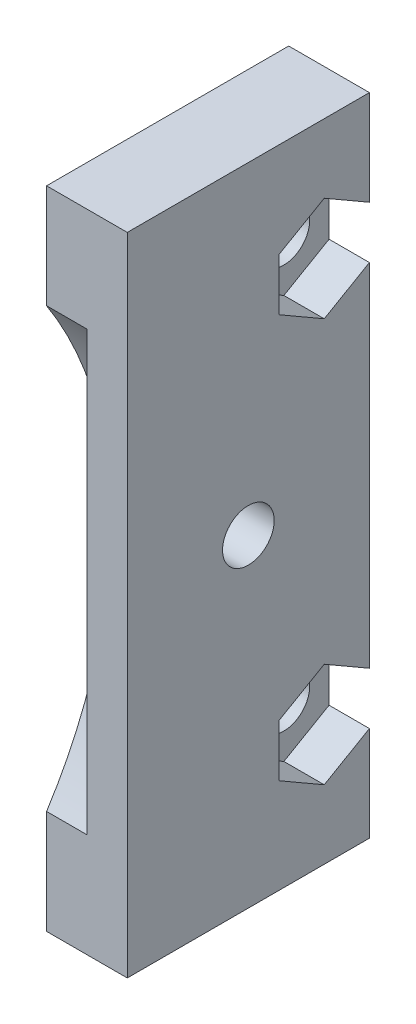
ISO-10303-21;
HEADER;
FILE_DESCRIPTION(('STEP AP214'),'2;1');
FILE_NAME('part.step','',(''),(''),'','','');
FILE_SCHEMA(('AUTOMOTIVE_DESIGN { 1 0 10303 214 1 1 1 1 }'));
ENDSEC;
DATA;
#1=APPLICATION_CONTEXT('core data for automotive mechanical design processes');
#2=APPLICATION_PROTOCOL_DEFINITION('international standard','automotive_design',2000,#1);
#3=PRODUCT_CONTEXT('',#1,'mechanical');
#4=PRODUCT('Part','Part','',(#3));
#5=PRODUCT_RELATED_PRODUCT_CATEGORY('part','',(#4));
#6=PRODUCT_DEFINITION_FORMATION('','',#4);
#7=PRODUCT_DEFINITION_CONTEXT('part definition',#1,'design');
#8=PRODUCT_DEFINITION('design','',#6,#7);
#9=PRODUCT_DEFINITION_SHAPE('','',#8);
#10=(LENGTH_UNIT() NAMED_UNIT(*) SI_UNIT(.MILLI.,.METRE.));
#11=(NAMED_UNIT(*) PLANE_ANGLE_UNIT() SI_UNIT($,.RADIAN.));
#12=(NAMED_UNIT(*) SI_UNIT($,.STERADIAN.) SOLID_ANGLE_UNIT());
#13=UNCERTAINTY_MEASURE_WITH_UNIT(LENGTH_MEASURE(1.E-05),#10,'distance_accuracy_value','');
#14=(GEOMETRIC_REPRESENTATION_CONTEXT(3) GLOBAL_UNCERTAINTY_ASSIGNED_CONTEXT((#13)) GLOBAL_UNIT_ASSIGNED_CONTEXT((#10,
#11,#12)) REPRESENTATION_CONTEXT('',''));
#15=CARTESIAN_POINT('',(0.,0.,0.));
#16=DIRECTION('',(0.,0.,1.));
#17=DIRECTION('',(1.,0.,0.));
#18=AXIS2_PLACEMENT_3D('',#15,#16,#17);
#19=CARTESIAN_POINT('',(-2.5,0.,0.));
#20=DIRECTION('',(1.,0.,0.));
#21=DIRECTION('',(0.,0.,-1.));
#22=AXIS2_PLACEMENT_3D('',#19,#20,#21);
#23=PLANE('',#22);
#24=CARTESIAN_POINT('',(-2.5,7.5,-12.2));
#25=DIRECTION('',(1.,0.,0.));
#26=DIRECTION('',(0.,0.,-1.));
#27=AXIS2_PLACEMENT_3D('',#24,#25,#26);
#28=CIRCLE('',#27,2.6);
#29=CARTESIAN_POINT('',(-2.5,7.5,-14.8));
#30=VERTEX_POINT('',#29);
#31=EDGE_CURVE('E72',#30,#30,#28,.F.);
#32=ORIENTED_EDGE('',*,*,#31,.F.);
#33=EDGE_LOOP('',(#32));
#34=FACE_BOUND('',#33,.T.);
#35=DIRECTION('',(0.,1.,0.));
#36=VECTOR('',#35,1.);
#37=CARTESIAN_POINT('',(-2.5,0.,0.));
#38=LINE('',#37,#36);
#39=CARTESIAN_POINT('',(-2.5,0.,0.));
#40=VERTEX_POINT('',#39);
#41=CARTESIAN_POINT('',(-2.5,6.43534003374946,0.));
#42=VERTEX_POINT('',#41);
#43=EDGE_CURVE('E284',#40,#42,#38,.T.);
#44=ORIENTED_EDGE('',*,*,#43,.T.);
#45=CARTESIAN_POINT('',(-2.5,20.,21.));
#46=DIRECTION('',(-1.,0.,0.));
#47=DIRECTION('',(0.,0.,1.));
#48=AXIS2_PLACEMENT_3D('',#45,#46,#47);
#49=CIRCLE('',#48,25.);
#50=CARTESIAN_POINT('',(-2.5,33.5646599662505,0.));
#51=VERTEX_POINT('',#50);
#52=EDGE_CURVE('E472',#51,#42,#49,.T.);
#53=ORIENTED_EDGE('',*,*,#52,.F.);
#54=CARTESIAN_POINT('',(-2.5,40.,0.));
#55=VERTEX_POINT('',#54);
#56=EDGE_CURVE('E393',#51,#55,#38,.T.);
#57=ORIENTED_EDGE('',*,*,#56,.T.);
#58=DIRECTION('',(0.,0.,-1.));
#59=VECTOR('',#58,1.);
#60=CARTESIAN_POINT('',(-2.5,40.,0.));
#61=LINE('',#60,#59);
#62=CARTESIAN_POINT('',(-2.5,40.,-15.));
#63=VERTEX_POINT('',#62);
#64=EDGE_CURVE('E396',#55,#63,#61,.T.);
#65=ORIENTED_EDGE('',*,*,#64,.T.);
#66=DIRECTION('',(0.,1.,0.));
#67=VECTOR('',#66,1.);
#68=CARTESIAN_POINT('',(-2.5,0.,-15.));
#69=LINE('',#68,#67);
#70=CARTESIAN_POINT('',(-2.5,0.,-15.));
#71=VERTEX_POINT('',#70);
#72=EDGE_CURVE('E197',#71,#63,#69,.T.);
#73=ORIENTED_EDGE('',*,*,#72,.F.);
#74=DIRECTION('',(0.,0.,-1.));
#75=VECTOR('',#74,1.);
#76=CARTESIAN_POINT('',(-2.5,0.,0.));
#77=LINE('',#76,#75);
#78=EDGE_CURVE('E385',#40,#71,#77,.T.);
#79=ORIENTED_EDGE('',*,*,#78,.F.);
#80=EDGE_LOOP('',(#44,#53,#57,#65,#73,#79));
#81=FACE_BOUND('',#80,.T.);
#82=CARTESIAN_POINT('',(-2.5,20.,-7.5));
#83=DIRECTION('',(1.,0.,0.));
#84=DIRECTION('',(0.,0.,-1.));
#85=AXIS2_PLACEMENT_3D('',#82,#83,#84);
#86=CIRCLE('',#85,1.6);
#87=CARTESIAN_POINT('',(-2.5,20.,-9.1));
#88=VERTEX_POINT('',#87);
#89=EDGE_CURVE('E215',#88,#88,#86,.T.);
#90=ORIENTED_EDGE('',*,*,#89,.T.);
#91=EDGE_LOOP('',(#90));
#92=FACE_BOUND('',#91,.T.);
#93=CARTESIAN_POINT('',(-2.5,32.5,-12.2));
#94=DIRECTION('',(1.,0.,0.));
#95=DIRECTION('',(0.,0.,-1.));
#96=AXIS2_PLACEMENT_3D('',#93,#94,#95);
#97=CIRCLE('',#96,2.6);
#98=CARTESIAN_POINT('',(-2.5,32.5,-14.8));
#99=VERTEX_POINT('',#98);
#100=EDGE_CURVE('E12',#99,#99,#97,.F.);
#101=ORIENTED_EDGE('',*,*,#100,.F.);
#102=EDGE_LOOP('',(#101));
#103=FACE_BOUND('',#102,.T.);
#104=ADVANCED_FACE('F64',(#34,#81,#92,#103),#23,.F.);
#105=CARTESIAN_POINT('',(2.5,0.,0.));
#106=DIRECTION('',(0.,1.,0.));
#107=DIRECTION('',(0.,0.,1.));
#108=AXIS2_PLACEMENT_3D('',#105,#106,#107);
#109=PLANE('',#108);
#110=DIRECTION('',(-1.,0.,0.));
#111=VECTOR('',#110,1.);
#112=CARTESIAN_POINT('',(2.5,0.,0.));
#113=LINE('',#112,#111);
#114=CARTESIAN_POINT('',(2.5,0.,0.));
#115=VERTEX_POINT('',#114);
#116=EDGE_CURVE('E87',#115,#40,#113,.T.);
#117=ORIENTED_EDGE('',*,*,#116,.T.);
#118=ORIENTED_EDGE('',*,*,#78,.T.);
#119=DIRECTION('',(-1.,0.,0.));
#120=VECTOR('',#119,1.);
#121=CARTESIAN_POINT('',(2.5,0.,-15.));
#122=LINE('',#121,#120);
#123=CARTESIAN_POINT('',(2.5,0.,-15.));
#124=VERTEX_POINT('',#123);
#125=EDGE_CURVE('E269',#124,#71,#122,.T.);
#126=ORIENTED_EDGE('',*,*,#125,.F.);
#127=DIRECTION('',(0.,0.,-1.));
#128=VECTOR('',#127,1.);
#129=CARTESIAN_POINT('',(2.5,0.,0.));
#130=LINE('',#129,#128);
#131=EDGE_CURVE('E386',#115,#124,#130,.T.);
#132=ORIENTED_EDGE('',*,*,#131,.F.);
#133=EDGE_LOOP('',(#117,#118,#126,#132));
#134=FACE_BOUND('',#133,.T.);
#135=ADVANCED_FACE('F277',(#134),#109,.F.);
#136=CARTESIAN_POINT('',(2.5,-2.08262609368152,-1.20240473580836));
#137=DIRECTION('',(0.,0.866025403784439,0.5));
#138=DIRECTION('',(0.,-0.5,0.866025403784439));
#139=AXIS2_PLACEMENT_3D('',#136,#137,#138);
#140=PLANE('',#139);
#141=DIRECTION('',(0.,0.5,-0.866025403784439));
#142=VECTOR('',#141,1.);
#143=CARTESIAN_POINT('',(0.,-2.08262609368152,-1.20240473580836));
#144=LINE('',#143,#142);
#145=CARTESIAN_POINT('',(0.,4.26683849253807,-12.2));
#146=VERTEX_POINT('',#145);
#147=CARTESIAN_POINT('',(0.,5.88341924626902,-15.));
#148=VERTEX_POINT('',#147);
#149=EDGE_CURVE('E211',#146,#148,#144,.T.);
#150=ORIENTED_EDGE('',*,*,#149,.F.);
#151=DIRECTION('',(-1.,0.,0.));
#152=VECTOR('',#151,1.);
#153=CARTESIAN_POINT('',(2.5,4.26683849253807,-12.2));
#154=LINE('',#153,#152);
#155=CARTESIAN_POINT('',(2.5,4.26683849253807,-12.2));
#156=VERTEX_POINT('',#155);
#157=EDGE_CURVE('E264',#156,#146,#154,.T.);
#158=ORIENTED_EDGE('',*,*,#157,.F.);
#159=DIRECTION('',(0.,0.5,-0.866025403784439));
#160=VECTOR('',#159,1.);
#161=CARTESIAN_POINT('',(2.5,-2.08262609368152,-1.20240473580836));
#162=LINE('',#161,#160);
#163=CARTESIAN_POINT('',(2.5,5.88341924626902,-15.));
#164=VERTEX_POINT('',#163);
#165=EDGE_CURVE('E416',#156,#164,#162,.T.);
#166=ORIENTED_EDGE('',*,*,#165,.T.);
#167=DIRECTION('',(-1.,0.,0.));
#168=VECTOR('',#167,1.);
#169=CARTESIAN_POINT('',(2.5,5.88341924626902,-15.));
#170=LINE('',#169,#168);
#171=EDGE_CURVE('E266',#164,#148,#170,.T.);
#172=ORIENTED_EDGE('',*,*,#171,.T.);
#173=EDGE_LOOP('',(#150,#158,#166,#172));
#174=FACE_BOUND('',#173,.T.);
#175=ADVANCED_FACE('F372',(#174),#140,.T.);
#176=CARTESIAN_POINT('',(2.5,8.48288383248863,-4.89759526419164));
#177=DIRECTION('',(0.,0.866025403784438,-0.5));
#178=DIRECTION('',(0.,0.5,0.866025403784438));
#179=AXIS2_PLACEMENT_3D('',#176,#177,#178);
#180=PLANE('',#179);
#181=DIRECTION('',(0.,-0.5,-0.866025403784438));
#182=VECTOR('',#181,1.);
#183=CARTESIAN_POINT('',(0.,8.48288383248863,-4.89759526419164));
#184=LINE('',#183,#182);
#185=CARTESIAN_POINT('',(0.,5.88341924626904,-9.39999999999997));
#186=VERTEX_POINT('',#185);
#187=EDGE_CURVE('E214',#186,#146,#184,.T.);
#188=ORIENTED_EDGE('',*,*,#187,.F.);
#189=DIRECTION('',(-1.,0.,0.));
#190=VECTOR('',#189,1.);
#191=CARTESIAN_POINT('',(2.5,5.88341924626904,-9.39999999999997));
#192=LINE('',#191,#190);
#193=CARTESIAN_POINT('',(2.5,5.88341924626904,-9.39999999999997));
#194=VERTEX_POINT('',#193);
#195=EDGE_CURVE('E262',#194,#186,#192,.T.);
#196=ORIENTED_EDGE('',*,*,#195,.F.);
#197=DIRECTION('',(0.,-0.5,-0.866025403784438));
#198=VECTOR('',#197,1.);
#199=CARTESIAN_POINT('',(2.5,8.48288383248863,-4.89759526419164));
#200=LINE('',#199,#198);
#201=EDGE_CURVE('E419',#194,#156,#200,.T.);
#202=ORIENTED_EDGE('',*,*,#201,.T.);
#203=ORIENTED_EDGE('',*,*,#157,.T.);
#204=EDGE_LOOP('',(#188,#196,#202,#203));
#205=FACE_BOUND('',#204,.T.);
#206=ADVANCED_FACE('F368',(#205),#180,.T.);
#207=CARTESIAN_POINT('',(2.5,0.,-9.39999999999997));
#208=DIRECTION('',(0.,0.,-1.));
#209=DIRECTION('',(-1.,0.,0.));
#210=AXIS2_PLACEMENT_3D('',#207,#208,#209);
#211=PLANE('',#210);
#212=DIRECTION('',(0.,-1.,0.));
#213=VECTOR('',#212,1.);
#214=CARTESIAN_POINT('',(0.,0.,-9.39999999999997));
#215=LINE('',#214,#213);
#216=CARTESIAN_POINT('',(0.,9.11658075373097,-9.39999999999998));
#217=VERTEX_POINT('',#216);
#218=EDGE_CURVE('E218',#217,#186,#215,.T.);
#219=ORIENTED_EDGE('',*,*,#218,.F.);
#220=DIRECTION('',(-1.,0.,0.));
#221=VECTOR('',#220,1.);
#222=CARTESIAN_POINT('',(2.5,9.11658075373097,-9.39999999999998));
#223=LINE('',#222,#221);
#224=CARTESIAN_POINT('',(2.5,9.11658075373097,-9.39999999999998));
#225=VERTEX_POINT('',#224);
#226=EDGE_CURVE('E260',#225,#217,#223,.T.);
#227=ORIENTED_EDGE('',*,*,#226,.F.);
#228=DIRECTION('',(0.,-1.,0.));
#229=VECTOR('',#228,1.);
#230=CARTESIAN_POINT('',(2.5,0.,-9.39999999999997));
#231=LINE('',#230,#229);
#232=EDGE_CURVE('E422',#225,#194,#231,.T.);
#233=ORIENTED_EDGE('',*,*,#232,.T.);
#234=ORIENTED_EDGE('',*,*,#195,.T.);
#235=EDGE_LOOP('',(#219,#227,#233,#234));
#236=FACE_BOUND('',#235,.T.);
#237=ADVANCED_FACE('F364',(#236),#211,.T.);
#238=CARTESIAN_POINT('',(2.5,2.76711616751138,1.59759526419166));
#239=DIRECTION('',(0.,-0.866025403784439,-0.5));
#240=DIRECTION('',(0.,0.5,-0.866025403784439));
#241=AXIS2_PLACEMENT_3D('',#238,#239,#240);
#242=PLANE('',#241);
#243=DIRECTION('',(0.,-0.5,0.866025403784439));
#244=VECTOR('',#243,1.);
#245=CARTESIAN_POINT('',(0.,2.76711616751138,1.59759526419166));
#246=LINE('',#245,#244);
#247=CARTESIAN_POINT('',(0.,10.7331615074619,-12.2));
#248=VERTEX_POINT('',#247);
#249=EDGE_CURVE('E221',#248,#217,#246,.T.);
#250=ORIENTED_EDGE('',*,*,#249,.F.);
#251=DIRECTION('',(-1.,0.,0.));
#252=VECTOR('',#251,1.);
#253=CARTESIAN_POINT('',(2.5,10.7331615074619,-12.2));
#254=LINE('',#253,#252);
#255=CARTESIAN_POINT('',(2.5,10.7331615074619,-12.2));
#256=VERTEX_POINT('',#255);
#257=EDGE_CURVE('E258',#256,#248,#254,.T.);
#258=ORIENTED_EDGE('',*,*,#257,.F.);
#259=DIRECTION('',(0.,-0.5,0.866025403784439));
#260=VECTOR('',#259,1.);
#261=CARTESIAN_POINT('',(2.5,2.76711616751138,1.59759526419166));
#262=LINE('',#261,#260);
#263=EDGE_CURVE('E425',#256,#225,#262,.T.);
#264=ORIENTED_EDGE('',*,*,#263,.T.);
#265=ORIENTED_EDGE('',*,*,#226,.T.);
#266=EDGE_LOOP('',(#250,#258,#264,#265));
#267=FACE_BOUND('',#266,.T.);
#268=ADVANCED_FACE('F360',(#267),#242,.T.);
#269=CARTESIAN_POINT('',(2.5,13.3326260936815,-7.69759526419166));
#270=DIRECTION('',(0.,-0.866025403784439,0.5));
#271=DIRECTION('',(0.,-0.5,-0.866025403784439));
#272=AXIS2_PLACEMENT_3D('',#269,#270,#271);
#273=PLANE('',#272);
#274=DIRECTION('',(0.,0.5,0.866025403784439));
#275=VECTOR('',#274,1.);
#276=CARTESIAN_POINT('',(0.,13.3326260936815,-7.69759526419166));
#277=LINE('',#276,#275);
#278=CARTESIAN_POINT('',(0.,9.11658075373096,-15.));
#279=VERTEX_POINT('',#278);
#280=EDGE_CURVE('E224',#279,#248,#277,.T.);
#281=ORIENTED_EDGE('',*,*,#280,.F.);
#282=DIRECTION('',(-1.,0.,0.));
#283=VECTOR('',#282,1.);
#284=CARTESIAN_POINT('',(2.5,9.11658075373096,-15.));
#285=LINE('',#284,#283);
#286=CARTESIAN_POINT('',(2.5,9.11658075373096,-15.));
#287=VERTEX_POINT('',#286);
#288=EDGE_CURVE('E256',#287,#279,#285,.T.);
#289=ORIENTED_EDGE('',*,*,#288,.F.);
#290=DIRECTION('',(0.,0.5,0.866025403784439));
#291=VECTOR('',#290,1.);
#292=CARTESIAN_POINT('',(2.5,13.3326260936815,-7.69759526419166));
#293=LINE('',#292,#291);
#294=EDGE_CURVE('E428',#287,#256,#293,.T.);
#295=ORIENTED_EDGE('',*,*,#294,.T.);
#296=ORIENTED_EDGE('',*,*,#257,.T.);
#297=EDGE_LOOP('',(#281,#289,#295,#296));
#298=FACE_BOUND('',#297,.T.);
#299=ADVANCED_FACE('F356',(#298),#273,.T.);
#300=CARTESIAN_POINT('',(2.5,16.6673739063185,9.62291281149714));
#301=DIRECTION('',(0.,0.866025403784438,0.500000000000001));
#302=DIRECTION('',(0.,-0.500000000000001,0.866025403784438));
#303=AXIS2_PLACEMENT_3D('',#300,#301,#302);
#304=PLANE('',#303);
#305=DIRECTION('',(0.,0.500000000000001,-0.866025403784438));
#306=VECTOR('',#305,1.);
#307=CARTESIAN_POINT('',(0.,16.6673739063185,9.62291281149714));
#308=LINE('',#307,#306);
#309=CARTESIAN_POINT('',(0.,29.2668384925381,-12.2));
#310=VERTEX_POINT('',#309);
#311=CARTESIAN_POINT('',(0.,30.8834192462691,-15.));
#312=VERTEX_POINT('',#311);
#313=EDGE_CURVE('E227',#310,#312,#308,.T.);
#314=ORIENTED_EDGE('',*,*,#313,.F.);
#315=DIRECTION('',(-1.,0.,0.));
#316=VECTOR('',#315,1.);
#317=CARTESIAN_POINT('',(2.5,29.2668384925381,-12.2));
#318=LINE('',#317,#316);
#319=CARTESIAN_POINT('',(2.5,29.2668384925381,-12.2));
#320=VERTEX_POINT('',#319);
#321=EDGE_CURVE('E252',#320,#310,#318,.T.);
#322=ORIENTED_EDGE('',*,*,#321,.F.);
#323=DIRECTION('',(0.,0.500000000000001,-0.866025403784438));
#324=VECTOR('',#323,1.);
#325=CARTESIAN_POINT('',(2.5,16.6673739063185,9.62291281149714));
#326=LINE('',#325,#324);
#327=CARTESIAN_POINT('',(2.5,30.8834192462691,-15.));
#328=VERTEX_POINT('',#327);
#329=EDGE_CURVE('E431',#320,#328,#326,.T.);
#330=ORIENTED_EDGE('',*,*,#329,.T.);
#331=DIRECTION('',(-1.,0.,0.));
#332=VECTOR('',#331,1.);
#333=CARTESIAN_POINT('',(2.5,30.8834192462691,-15.));
#334=LINE('',#333,#332);
#335=EDGE_CURVE('E254',#328,#312,#334,.T.);
#336=ORIENTED_EDGE('',*,*,#335,.T.);
#337=EDGE_LOOP('',(#314,#322,#330,#336));
#338=FACE_BOUND('',#337,.T.);
#339=ADVANCED_FACE('F352',(#338),#304,.T.);
#340=CARTESIAN_POINT('',(2.5,27.2328838324886,-15.7229128114972));
#341=DIRECTION('',(0.,0.866025403784438,-0.500000000000001));
#342=DIRECTION('',(0.,0.500000000000001,0.866025403784438));
#343=AXIS2_PLACEMENT_3D('',#340,#341,#342);
#344=PLANE('',#343);
#345=DIRECTION('',(0.,-0.500000000000001,-0.866025403784438));
#346=VECTOR('',#345,1.);
#347=CARTESIAN_POINT('',(0.,27.2328838324886,-15.7229128114972));
#348=LINE('',#347,#346);
#349=CARTESIAN_POINT('',(0.,30.8834192462691,-9.40000000000002));
#350=VERTEX_POINT('',#349);
#351=EDGE_CURVE('E230',#350,#310,#348,.T.);
#352=ORIENTED_EDGE('',*,*,#351,.F.);
#353=DIRECTION('',(-1.,0.,0.));
#354=VECTOR('',#353,1.);
#355=CARTESIAN_POINT('',(2.5,30.8834192462691,-9.40000000000002));
#356=LINE('',#355,#354);
#357=CARTESIAN_POINT('',(2.5,30.8834192462691,-9.40000000000002));
#358=VERTEX_POINT('',#357);
#359=EDGE_CURVE('E250',#358,#350,#356,.T.);
#360=ORIENTED_EDGE('',*,*,#359,.F.);
#361=DIRECTION('',(0.,-0.500000000000001,-0.866025403784438));
#362=VECTOR('',#361,1.);
#363=CARTESIAN_POINT('',(2.5,27.2328838324886,-15.7229128114972));
#364=LINE('',#363,#362);
#365=EDGE_CURVE('E434',#358,#320,#364,.T.);
#366=ORIENTED_EDGE('',*,*,#365,.T.);
#367=ORIENTED_EDGE('',*,*,#321,.T.);
#368=EDGE_LOOP('',(#352,#360,#366,#367));
#369=FACE_BOUND('',#368,.T.);
#370=ADVANCED_FACE('F348',(#369),#344,.T.);
#371=CARTESIAN_POINT('',(2.5,0.,-9.40000000000002));
#372=DIRECTION('',(0.,0.,-1.));
#373=DIRECTION('',(-1.,0.,0.));
#374=AXIS2_PLACEMENT_3D('',#371,#372,#373);
#375=PLANE('',#374);
#376=DIRECTION('',(0.,-1.,0.));
#377=VECTOR('',#376,1.);
#378=CARTESIAN_POINT('',(0.,0.,-9.40000000000002));
#379=LINE('',#378,#377);
#380=CARTESIAN_POINT('',(0.,34.1165807537309,-9.40000000000002));
#381=VERTEX_POINT('',#380);
#382=EDGE_CURVE('E233',#381,#350,#379,.T.);
#383=ORIENTED_EDGE('',*,*,#382,.F.);
#384=DIRECTION('',(-1.,0.,0.));
#385=VECTOR('',#384,1.);
#386=CARTESIAN_POINT('',(2.5,34.1165807537309,-9.40000000000002));
#387=LINE('',#386,#385);
#388=CARTESIAN_POINT('',(2.5,34.1165807537309,-9.40000000000002));
#389=VERTEX_POINT('',#388);
#390=EDGE_CURVE('E248',#389,#381,#387,.T.);
#391=ORIENTED_EDGE('',*,*,#390,.F.);
#392=DIRECTION('',(0.,-1.,0.));
#393=VECTOR('',#392,1.);
#394=CARTESIAN_POINT('',(2.5,0.,-9.40000000000002));
#395=LINE('',#394,#393);
#396=EDGE_CURVE('E437',#389,#358,#395,.T.);
#397=ORIENTED_EDGE('',*,*,#396,.T.);
#398=ORIENTED_EDGE('',*,*,#359,.T.);
#399=EDGE_LOOP('',(#383,#391,#397,#398));
#400=FACE_BOUND('',#399,.T.);
#401=ADVANCED_FACE('F344',(#400),#375,.T.);
#402=CARTESIAN_POINT('',(2.5,21.5171161675113,12.4229128114971));
#403=DIRECTION('',(0.,-0.866025403784438,-0.500000000000002));
#404=DIRECTION('',(0.,0.500000000000002,-0.866025403784438));
#405=AXIS2_PLACEMENT_3D('',#402,#403,#404);
#406=PLANE('',#405);
#407=DIRECTION('',(0.,-0.500000000000002,0.866025403784438));
#408=VECTOR('',#407,1.);
#409=CARTESIAN_POINT('',(0.,21.5171161675113,12.4229128114971));
#410=LINE('',#409,#408);
#411=CARTESIAN_POINT('',(0.,35.7331615074619,-12.2));
#412=VERTEX_POINT('',#411);
#413=EDGE_CURVE('E236',#412,#381,#410,.T.);
#414=ORIENTED_EDGE('',*,*,#413,.F.);
#415=DIRECTION('',(-1.,0.,0.));
#416=VECTOR('',#415,1.);
#417=CARTESIAN_POINT('',(2.5,35.7331615074619,-12.2));
#418=LINE('',#417,#416);
#419=CARTESIAN_POINT('',(2.5,35.7331615074619,-12.2));
#420=VERTEX_POINT('',#419);
#421=EDGE_CURVE('E246',#420,#412,#418,.T.);
#422=ORIENTED_EDGE('',*,*,#421,.F.);
#423=DIRECTION('',(0.,-0.500000000000002,0.866025403784438));
#424=VECTOR('',#423,1.);
#425=CARTESIAN_POINT('',(2.5,21.5171161675113,12.4229128114971));
#426=LINE('',#425,#424);
#427=EDGE_CURVE('E439',#420,#389,#426,.T.);
#428=ORIENTED_EDGE('',*,*,#427,.T.);
#429=ORIENTED_EDGE('',*,*,#390,.T.);
#430=EDGE_LOOP('',(#414,#422,#428,#429));
#431=FACE_BOUND('',#430,.T.);
#432=ADVANCED_FACE('F340',(#431),#406,.T.);
#433=CARTESIAN_POINT('',(2.5,32.0826260936814,-18.5229128114972));
#434=DIRECTION('',(0.,-0.866025403784437,0.500000000000003));
#435=DIRECTION('',(0.,-0.500000000000003,-0.866025403784437));
#436=AXIS2_PLACEMENT_3D('',#433,#434,#435);
#437=PLANE('',#436);
#438=DIRECTION('',(0.,0.500000000000003,0.866025403784437));
#439=VECTOR('',#438,1.);
#440=CARTESIAN_POINT('',(0.,32.0826260936814,-18.5229128114972));
#441=LINE('',#440,#439);
#442=CARTESIAN_POINT('',(0.,34.116580753731,-15.));
#443=VERTEX_POINT('',#442);
#444=EDGE_CURVE('E239',#443,#412,#441,.T.);
#445=ORIENTED_EDGE('',*,*,#444,.F.);
#446=DIRECTION('',(-1.,0.,0.));
#447=VECTOR('',#446,1.);
#448=CARTESIAN_POINT('',(2.5,34.116580753731,-15.));
#449=LINE('',#448,#447);
#450=CARTESIAN_POINT('',(2.5,34.116580753731,-15.));
#451=VERTEX_POINT('',#450);
#452=EDGE_CURVE('E131',#451,#443,#449,.T.);
#453=ORIENTED_EDGE('',*,*,#452,.F.);
#454=DIRECTION('',(0.,0.500000000000003,0.866025403784437));
#455=VECTOR('',#454,1.);
#456=CARTESIAN_POINT('',(2.5,32.0826260936814,-18.5229128114972));
#457=LINE('',#456,#455);
#458=EDGE_CURVE('E188',#451,#420,#457,.T.);
#459=ORIENTED_EDGE('',*,*,#458,.T.);
#460=ORIENTED_EDGE('',*,*,#421,.T.);
#461=EDGE_LOOP('',(#445,#453,#459,#460));
#462=FACE_BOUND('',#461,.T.);
#463=ADVANCED_FACE('F337',(#462),#437,.T.);
#464=CARTESIAN_POINT('',(2.5,0.,-15.));
#465=DIRECTION('',(0.,0.,1.));
#466=DIRECTION('',(1.,0.,0.));
#467=AXIS2_PLACEMENT_3D('',#464,#465,#466);
#468=PLANE('',#467);
#469=ORIENTED_EDGE('',*,*,#452,.T.);
#470=DIRECTION('',(0.,1.,0.));
#471=VECTOR('',#470,1.);
#472=CARTESIAN_POINT('',(0.,0.,-15.));
#473=LINE('',#472,#471);
#474=EDGE_CURVE('E402',#312,#443,#473,.T.);
#475=ORIENTED_EDGE('',*,*,#474,.F.);
#476=ORIENTED_EDGE('',*,*,#335,.F.);
#477=DIRECTION('',(0.,1.,0.));
#478=VECTOR('',#477,1.);
#479=CARTESIAN_POINT('',(2.5,0.,-15.));
#480=LINE('',#479,#478);
#481=EDGE_CURVE('E190',#287,#328,#480,.T.);
#482=ORIENTED_EDGE('',*,*,#481,.F.);
#483=ORIENTED_EDGE('',*,*,#288,.T.);
#484=EDGE_CURVE('E405',#148,#279,#473,.T.);
#485=ORIENTED_EDGE('',*,*,#484,.F.);
#486=ORIENTED_EDGE('',*,*,#171,.F.);
#487=EDGE_CURVE('E139',#124,#164,#480,.T.);
#488=ORIENTED_EDGE('',*,*,#487,.F.);
#489=ORIENTED_EDGE('',*,*,#125,.T.);
#490=ORIENTED_EDGE('',*,*,#72,.T.);
#491=DIRECTION('',(-1.,0.,0.));
#492=VECTOR('',#491,1.);
#493=CARTESIAN_POINT('',(2.5,40.,-15.));
#494=LINE('',#493,#492);
#495=CARTESIAN_POINT('',(2.5,40.,-15.));
#496=VERTEX_POINT('',#495);
#497=EDGE_CURVE('E193',#496,#63,#494,.T.);
#498=ORIENTED_EDGE('',*,*,#497,.F.);
#499=EDGE_CURVE('E180',#451,#496,#480,.T.);
#500=ORIENTED_EDGE('',*,*,#499,.F.);
#501=EDGE_LOOP('',(#469,#475,#476,#482,#483,#485,#486,#488,#489,#490,#498,#500));
#502=FACE_BOUND('',#501,.T.);
#503=ADVANCED_FACE('F194',(#502),#468,.F.);
#504=CARTESIAN_POINT('',(2.5,40.,0.));
#505=DIRECTION('',(0.,1.,0.));
#506=DIRECTION('',(0.,0.,1.));
#507=AXIS2_PLACEMENT_3D('',#504,#505,#506);
#508=PLANE('',#507);
#509=ORIENTED_EDGE('',*,*,#497,.T.);
#510=ORIENTED_EDGE('',*,*,#64,.F.);
#511=DIRECTION('',(-1.,0.,0.));
#512=VECTOR('',#511,1.);
#513=CARTESIAN_POINT('',(2.5,40.,0.));
#514=LINE('',#513,#512);
#515=CARTESIAN_POINT('',(2.5,40.,0.));
#516=VERTEX_POINT('',#515);
#517=EDGE_CURVE('E201',#516,#55,#514,.T.);
#518=ORIENTED_EDGE('',*,*,#517,.F.);
#519=DIRECTION('',(0.,0.,-1.));
#520=VECTOR('',#519,1.);
#521=CARTESIAN_POINT('',(2.5,40.,0.));
#522=LINE('',#521,#520);
#523=EDGE_CURVE('E185',#516,#496,#522,.T.);
#524=ORIENTED_EDGE('',*,*,#523,.T.);
#525=EDGE_LOOP('',(#509,#510,#518,#524));
#526=FACE_BOUND('',#525,.T.);
#527=ADVANCED_FACE('F203',(#526),#508,.T.);
#528=CARTESIAN_POINT('',(2.5,20.,-7.5));
#529=DIRECTION('',(-1.,0.,0.));
#530=DIRECTION('',(0.,0.,1.));
#531=AXIS2_PLACEMENT_3D('',#528,#529,#530);
#532=CYLINDRICAL_SURFACE('',#531,1.6);
#533=CARTESIAN_POINT('',(2.5,20.,-7.5));
#534=DIRECTION('',(1.,0.,0.));
#535=DIRECTION('',(0.,0.,-1.));
#536=AXIS2_PLACEMENT_3D('',#533,#534,#535);
#537=CIRCLE('',#536,1.6);
#538=CARTESIAN_POINT('',(2.5,20.,-9.1));
#539=VERTEX_POINT('',#538);
#540=EDGE_CURVE('E242',#539,#539,#537,.T.);
#541=ORIENTED_EDGE('',*,*,#540,.T.);
#542=EDGE_LOOP('',(#541));
#543=FACE_BOUND('',#542,.T.);
#544=ORIENTED_EDGE('',*,*,#89,.F.);
#545=EDGE_LOOP('',(#544));
#546=FACE_BOUND('',#545,.T.);
#547=ADVANCED_FACE('F66',(#543,#546),#532,.F.);
#548=CARTESIAN_POINT('',(2.5,0.,0.));
#549=DIRECTION('',(0.,0.,1.));
#550=DIRECTION('',(1.,0.,0.));
#551=AXIS2_PLACEMENT_3D('',#548,#549,#550);
#552=PLANE('',#551);
#553=DIRECTION('',(-1.,0.,0.));
#554=VECTOR('',#553,1.);
#555=CARTESIAN_POINT('',(0.,33.5646599662505,0.));
#556=LINE('',#555,#554);
#557=CARTESIAN_POINT('',(0.,33.5646599662505,0.));
#558=VERTEX_POINT('',#557);
#559=EDGE_CURVE('E474',#558,#51,#556,.T.);
#560=ORIENTED_EDGE('',*,*,#559,.F.);
#561=DIRECTION('',(0.,1.,0.));
#562=VECTOR('',#561,1.);
#563=CARTESIAN_POINT('',(0.,0.,0.));
#564=LINE('',#563,#562);
#565=CARTESIAN_POINT('',(0.,6.43534003374946,0.));
#566=VERTEX_POINT('',#565);
#567=EDGE_CURVE('E477',#566,#558,#564,.T.);
#568=ORIENTED_EDGE('',*,*,#567,.F.);
#569=DIRECTION('',(-1.,0.,0.));
#570=VECTOR('',#569,1.);
#571=CARTESIAN_POINT('',(0.,6.43534003374946,0.));
#572=LINE('',#571,#570);
#573=EDGE_CURVE('E392',#566,#42,#572,.T.);
#574=ORIENTED_EDGE('',*,*,#573,.T.);
#575=ORIENTED_EDGE('',*,*,#43,.F.);
#576=ORIENTED_EDGE('',*,*,#116,.F.);
#577=DIRECTION('',(0.,1.,0.));
#578=VECTOR('',#577,1.);
#579=CARTESIAN_POINT('',(2.5,0.,0.));
#580=LINE('',#579,#578);
#581=EDGE_CURVE('E205',#115,#516,#580,.T.);
#582=ORIENTED_EDGE('',*,*,#581,.T.);
#583=ORIENTED_EDGE('',*,*,#517,.T.);
#584=ORIENTED_EDGE('',*,*,#56,.F.);
#585=EDGE_LOOP('',(#560,#568,#574,#575,#576,#582,#583,#584));
#586=FACE_BOUND('',#585,.T.);
#587=ADVANCED_FACE('F329',(#586),#552,.T.);
#588=CARTESIAN_POINT('',(2.5,0.,0.));
#589=DIRECTION('',(1.,0.,0.));
#590=DIRECTION('',(0.,0.,-1.));
#591=AXIS2_PLACEMENT_3D('',#588,#589,#590);
#592=PLANE('',#591);
#593=ORIENTED_EDGE('',*,*,#540,.F.);
#594=EDGE_LOOP('',(#593));
#595=FACE_BOUND('',#594,.T.);
#596=ORIENTED_EDGE('',*,*,#131,.T.);
#597=ORIENTED_EDGE('',*,*,#487,.T.);
#598=ORIENTED_EDGE('',*,*,#165,.F.);
#599=ORIENTED_EDGE('',*,*,#201,.F.);
#600=ORIENTED_EDGE('',*,*,#232,.F.);
#601=ORIENTED_EDGE('',*,*,#263,.F.);
#602=ORIENTED_EDGE('',*,*,#294,.F.);
#603=ORIENTED_EDGE('',*,*,#481,.T.);
#604=ORIENTED_EDGE('',*,*,#329,.F.);
#605=ORIENTED_EDGE('',*,*,#365,.F.);
#606=ORIENTED_EDGE('',*,*,#396,.F.);
#607=ORIENTED_EDGE('',*,*,#427,.F.);
#608=ORIENTED_EDGE('',*,*,#458,.F.);
#609=ORIENTED_EDGE('',*,*,#499,.T.);
#610=ORIENTED_EDGE('',*,*,#523,.F.);
#611=ORIENTED_EDGE('',*,*,#581,.F.);
#612=EDGE_LOOP('',(#596,#597,#598,#599,#600,#601,#602,#603,#604,#605,#606,#607,#608,#609,#610,#611));
#613=FACE_BOUND('',#612,.T.);
#614=ADVANCED_FACE('F182',(#595,#613),#592,.T.);
#615=CARTESIAN_POINT('',(0.,0.,0.));
#616=DIRECTION('',(1.,0.,0.));
#617=DIRECTION('',(0.,0.,-1.));
#618=AXIS2_PLACEMENT_3D('',#615,#616,#617);
#619=PLANE('',#618);
#620=CARTESIAN_POINT('',(0.,32.5,-12.2));
#621=DIRECTION('',(1.,0.,0.));
#622=DIRECTION('',(0.,0.,-1.));
#623=AXIS2_PLACEMENT_3D('',#620,#621,#622);
#624=CIRCLE('',#623,1.6);
#625=CARTESIAN_POINT('',(0.,32.5,-13.8));
#626=VERTEX_POINT('',#625);
#627=EDGE_CURVE('E407',#626,#626,#624,.T.);
#628=ORIENTED_EDGE('',*,*,#627,.F.);
#629=EDGE_LOOP('',(#628));
#630=FACE_BOUND('',#629,.T.);
#631=ORIENTED_EDGE('',*,*,#474,.T.);
#632=ORIENTED_EDGE('',*,*,#444,.T.);
#633=ORIENTED_EDGE('',*,*,#413,.T.);
#634=ORIENTED_EDGE('',*,*,#382,.T.);
#635=ORIENTED_EDGE('',*,*,#351,.T.);
#636=ORIENTED_EDGE('',*,*,#313,.T.);
#637=EDGE_LOOP('',(#631,#632,#633,#634,#635,#636));
#638=FACE_BOUND('',#637,.T.);
#639=ADVANCED_FACE('F319',(#630,#638),#619,.T.);
#640=CARTESIAN_POINT('',(-2.5,32.5,-12.2));
#641=DIRECTION('',(1.,0.,0.));
#642=DIRECTION('',(0.,0.,-1.));
#643=AXIS2_PLACEMENT_3D('',#640,#641,#642);
#644=CYLINDRICAL_SURFACE('',#643,1.6);
#645=ORIENTED_EDGE('',*,*,#627,.T.);
#646=EDGE_LOOP('',(#645));
#647=FACE_BOUND('',#646,.T.);
#648=CARTESIAN_POINT('',(-3.5,32.5,-12.2));
#649=DIRECTION('',(-1.,0.,0.));
#650=DIRECTION('',(0.,0.,1.));
#651=AXIS2_PLACEMENT_3D('',#648,#649,#650);
#652=CIRCLE('',#651,1.6);
#653=CARTESIAN_POINT('',(-3.5,32.5,-10.6));
#654=VERTEX_POINT('',#653);
#655=EDGE_CURVE('E483',#654,#654,#652,.T.);
#656=ORIENTED_EDGE('',*,*,#655,.T.);
#657=EDGE_LOOP('',(#656));
#658=FACE_BOUND('',#657,.T.);
#659=ADVANCED_FACE('F322',(#647,#658),#644,.F.);
#660=CARTESIAN_POINT('',(-2.5,7.5,-12.2));
#661=DIRECTION('',(1.,0.,0.));
#662=DIRECTION('',(0.,0.,-1.));
#663=AXIS2_PLACEMENT_3D('',#660,#661,#662);
#664=CYLINDRICAL_SURFACE('',#663,1.6);
#665=CARTESIAN_POINT('',(0.,7.5,-12.2));
#666=DIRECTION('',(1.,0.,0.));
#667=DIRECTION('',(0.,0.,-1.));
#668=AXIS2_PLACEMENT_3D('',#665,#666,#667);
#669=CIRCLE('',#668,1.6);
#670=CARTESIAN_POINT('',(0.,7.5,-13.8));
#671=VERTEX_POINT('',#670);
#672=EDGE_CURVE('E410',#671,#671,#669,.T.);
#673=ORIENTED_EDGE('',*,*,#672,.T.);
#674=EDGE_LOOP('',(#673));
#675=FACE_BOUND('',#674,.T.);
#676=CARTESIAN_POINT('',(-3.5,7.5,-12.2));
#677=DIRECTION('',(-1.,0.,0.));
#678=DIRECTION('',(0.,0.,1.));
#679=AXIS2_PLACEMENT_3D('',#676,#677,#678);
#680=CIRCLE('',#679,1.6);
#681=CARTESIAN_POINT('',(-3.5,7.5,-10.6));
#682=VERTEX_POINT('',#681);
#683=EDGE_CURVE('E490',#682,#682,#680,.T.);
#684=ORIENTED_EDGE('',*,*,#683,.T.);
#685=EDGE_LOOP('',(#684));
#686=FACE_BOUND('',#685,.T.);
#687=ADVANCED_FACE('F317',(#675,#686),#664,.F.);
#688=ORIENTED_EDGE('',*,*,#484,.T.);
#689=ORIENTED_EDGE('',*,*,#280,.T.);
#690=ORIENTED_EDGE('',*,*,#249,.T.);
#691=ORIENTED_EDGE('',*,*,#218,.T.);
#692=ORIENTED_EDGE('',*,*,#187,.T.);
#693=ORIENTED_EDGE('',*,*,#149,.T.);
#694=EDGE_LOOP('',(#688,#689,#690,#691,#692,#693));
#695=FACE_BOUND('',#694,.T.);
#696=ORIENTED_EDGE('',*,*,#672,.F.);
#697=EDGE_LOOP('',(#696));
#698=FACE_BOUND('',#697,.T.);
#699=ADVANCED_FACE('F310',(#695,#698),#619,.T.);
#700=CARTESIAN_POINT('',(-3.5,7.5,-12.2));
#701=DIRECTION('',(-1.,0.,0.));
#702=DIRECTION('',(0.,0.,1.));
#703=AXIS2_PLACEMENT_3D('',#700,#701,#702);
#704=PLANE('',#703);
#705=CARTESIAN_POINT('',(-3.5,7.5,-12.2));
#706=DIRECTION('',(-1.,0.,0.));
#707=DIRECTION('',(0.,0.,1.));
#708=AXIS2_PLACEMENT_3D('',#705,#706,#707);
#709=CIRCLE('',#708,2.6);
#710=CARTESIAN_POINT('',(-3.5,7.5,-9.6));
#711=VERTEX_POINT('',#710);
#712=EDGE_CURVE('E406',#711,#711,#709,.T.);
#713=ORIENTED_EDGE('',*,*,#712,.T.);
#714=EDGE_LOOP('',(#713));
#715=FACE_BOUND('',#714,.T.);
#716=ORIENTED_EDGE('',*,*,#683,.F.);
#717=EDGE_LOOP('',(#716));
#718=FACE_BOUND('',#717,.T.);
#719=ADVANCED_FACE('F307',(#715,#718),#704,.T.);
#720=CARTESIAN_POINT('',(-3.5,7.5,-12.2));
#721=DIRECTION('',(1.,0.,0.));
#722=DIRECTION('',(0.,0.,-1.));
#723=AXIS2_PLACEMENT_3D('',#720,#721,#722);
#724=CYLINDRICAL_SURFACE('',#723,2.6);
#725=ORIENTED_EDGE('',*,*,#712,.F.);
#726=EDGE_LOOP('',(#725));
#727=FACE_BOUND('',#726,.T.);
#728=ORIENTED_EDGE('',*,*,#31,.T.);
#729=EDGE_LOOP('',(#728));
#730=FACE_BOUND('',#729,.T.);
#731=ADVANCED_FACE('F273',(#727,#730),#724,.T.);
#732=CARTESIAN_POINT('',(-3.5,32.5,-12.2));
#733=DIRECTION('',(-1.,0.,0.));
#734=DIRECTION('',(0.,0.,1.));
#735=AXIS2_PLACEMENT_3D('',#732,#733,#734);
#736=PLANE('',#735);
#737=CARTESIAN_POINT('',(-3.5,32.5,-12.2));
#738=DIRECTION('',(-1.,0.,0.));
#739=DIRECTION('',(0.,0.,1.));
#740=AXIS2_PLACEMENT_3D('',#737,#738,#739);
#741=CIRCLE('',#740,2.6);
#742=CARTESIAN_POINT('',(-3.5,32.5,-9.60000000000001));
#743=VERTEX_POINT('',#742);
#744=EDGE_CURVE('E487',#743,#743,#741,.T.);
#745=ORIENTED_EDGE('',*,*,#744,.T.);
#746=EDGE_LOOP('',(#745));
#747=FACE_BOUND('',#746,.T.);
#748=ORIENTED_EDGE('',*,*,#655,.F.);
#749=EDGE_LOOP('',(#748));
#750=FACE_BOUND('',#749,.T.);
#751=ADVANCED_FACE('F293',(#747,#750),#736,.T.);
#752=CARTESIAN_POINT('',(-3.5,32.5,-12.2));
#753=DIRECTION('',(1.,0.,0.));
#754=DIRECTION('',(0.,0.,-1.));
#755=AXIS2_PLACEMENT_3D('',#752,#753,#754);
#756=CYLINDRICAL_SURFACE('',#755,2.6);
#757=ORIENTED_EDGE('',*,*,#744,.F.);
#758=EDGE_LOOP('',(#757));
#759=FACE_BOUND('',#758,.T.);
#760=ORIENTED_EDGE('',*,*,#100,.T.);
#761=EDGE_LOOP('',(#760));
#762=FACE_BOUND('',#761,.T.);
#763=ADVANCED_FACE('F290',(#759,#762),#756,.T.);
#764=CARTESIAN_POINT('',(0.,20.,21.));
#765=DIRECTION('',(-1.,0.,0.));
#766=DIRECTION('',(0.,0.,1.));
#767=AXIS2_PLACEMENT_3D('',#764,#765,#766);
#768=CYLINDRICAL_SURFACE('',#767,25.);
#769=ORIENTED_EDGE('',*,*,#52,.T.);
#770=ORIENTED_EDGE('',*,*,#573,.F.);
#771=CARTESIAN_POINT('',(0.,20.,21.));
#772=DIRECTION('',(-1.,0.,0.));
#773=DIRECTION('',(0.,0.,1.));
#774=AXIS2_PLACEMENT_3D('',#771,#772,#773);
#775=CIRCLE('',#774,25.);
#776=EDGE_CURVE('E78',#558,#566,#775,.T.);
#777=ORIENTED_EDGE('',*,*,#776,.F.);
#778=ORIENTED_EDGE('',*,*,#559,.T.);
#779=EDGE_LOOP('',(#769,#770,#777,#778));
#780=FACE_BOUND('',#779,.T.);
#781=ADVANCED_FACE('F292',(#780),#768,.F.);
#782=CARTESIAN_POINT('',(0.,0.,0.));
#783=DIRECTION('',(-1.,0.,0.));
#784=DIRECTION('',(0.,0.,1.));
#785=AXIS2_PLACEMENT_3D('',#782,#783,#784);
#786=PLANE('',#785);
#787=ORIENTED_EDGE('',*,*,#567,.T.);
#788=ORIENTED_EDGE('',*,*,#776,.T.);
#789=EDGE_LOOP('',(#787,#788));
#790=FACE_BOUND('',#789,.T.);
#791=ADVANCED_FACE('F300',(#790),#786,.T.);
#792=CLOSED_SHELL('',(#104,#135,#175,#206,#237,#268,#299,#339,#370,#401,#432,#463,#503,#527,
#547,#587,#614,#639,#659,#687,#699,#719,#731,#751,#763,#781,#791));
#793=MANIFOLD_SOLID_BREP('B2',#792);
#794=ADVANCED_BREP_SHAPE_REPRESENTATION('',(#18,#793),#14);
#795=SHAPE_DEFINITION_REPRESENTATION(#9,#794);
ENDSEC;
END-ISO-10303-21;
